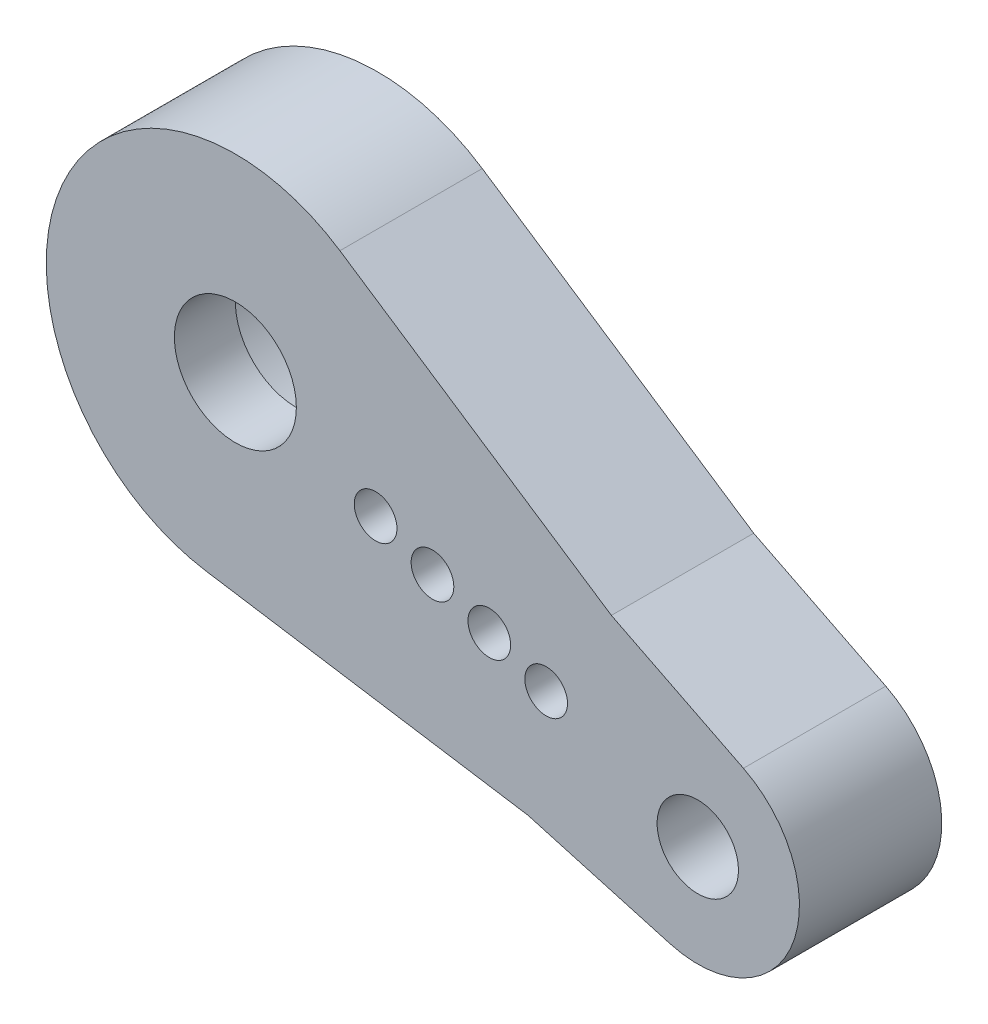
ISO-10303-21;
HEADER;
FILE_DESCRIPTION(('STEP AP214'),'2;1');
FILE_NAME('part.step','',(''),(''),'','','');
FILE_SCHEMA(('AUTOMOTIVE_DESIGN { 1 0 10303 214 1 1 1 1 }'));
ENDSEC;
DATA;
#1=APPLICATION_CONTEXT('core data for automotive mechanical design processes');
#2=APPLICATION_PROTOCOL_DEFINITION('international standard','automotive_design',2000,#1);
#3=PRODUCT_CONTEXT('',#1,'mechanical');
#4=PRODUCT('Part','Part','',(#3));
#5=PRODUCT_RELATED_PRODUCT_CATEGORY('part','',(#4));
#6=PRODUCT_DEFINITION_FORMATION('','',#4);
#7=PRODUCT_DEFINITION_CONTEXT('part definition',#1,'design');
#8=PRODUCT_DEFINITION('design','',#6,#7);
#9=PRODUCT_DEFINITION_SHAPE('','',#8);
#10=(LENGTH_UNIT() NAMED_UNIT(*) SI_UNIT(.MILLI.,.METRE.));
#11=(NAMED_UNIT(*) PLANE_ANGLE_UNIT() SI_UNIT($,.RADIAN.));
#12=(NAMED_UNIT(*) SI_UNIT($,.STERADIAN.) SOLID_ANGLE_UNIT());
#13=UNCERTAINTY_MEASURE_WITH_UNIT(LENGTH_MEASURE(1.E-05),#10,'distance_accuracy_value','');
#14=(GEOMETRIC_REPRESENTATION_CONTEXT(3) GLOBAL_UNCERTAINTY_ASSIGNED_CONTEXT((#13)) GLOBAL_UNIT_ASSIGNED_CONTEXT((#10,
#11,#12)) REPRESENTATION_CONTEXT('',''));
#15=CARTESIAN_POINT('',(0.,0.,0.));
#16=DIRECTION('',(0.,0.,1.));
#17=DIRECTION('',(1.,0.,0.));
#18=AXIS2_PLACEMENT_3D('',#15,#16,#17);
#19=CARTESIAN_POINT('',(0.,0.,0.));
#20=DIRECTION('',(0.,0.,1.));
#21=DIRECTION('',(1.,0.,0.));
#22=AXIS2_PLACEMENT_3D('',#19,#20,#21);
#23=PLANE('',#22);
#24=CARTESIAN_POINT('',(0.,0.,0.));
#25=DIRECTION('',(0.,0.,1.));
#26=DIRECTION('',(1.,0.,0.));
#27=AXIS2_PLACEMENT_3D('',#24,#25,#26);
#28=CIRCLE('',#27,9.29999999999741);
#29=CARTESIAN_POINT('',(5.14147990563152,7.74952801013966,0.));
#30=VERTEX_POINT('',#29);
#31=CARTESIAN_POINT('',(-1.44161315957256,-9.18758681581291,0.));
#32=VERTEX_POINT('',#31);
#33=EDGE_CURVE('E135',#30,#32,#28,.T.);
#34=ORIENTED_EDGE('',*,*,#33,.F.);
#35=DIRECTION('',(-0.833282581735452,0.552847301681304,0.));
#36=VECTOR('',#35,1.);
#37=CARTESIAN_POINT('',(5.14147990563152,7.74952801013966,0.));
#38=LINE('',#37,#36);
#39=CARTESIAN_POINT('',(18.4924768692821,-1.1082866230874,0.));
#40=VERTEX_POINT('',#39);
#41=EDGE_CURVE('E134',#40,#30,#38,.T.);
#42=ORIENTED_EDGE('',*,*,#41,.F.);
#43=DIRECTION('',(-0.893541598745588,0.448980413059609,0.));
#44=VECTOR('',#43,1.);
#45=CARTESIAN_POINT('',(18.4924768692821,-1.1082866230874,0.));
#46=LINE('',#45,#44);
#47=CARTESIAN_POINT('',(24.9874316675281,-4.37182521179307,0.));
#48=VERTEX_POINT('',#47);
#49=EDGE_CURVE('E155',#48,#40,#46,.T.);
#50=ORIENTED_EDGE('',*,*,#49,.F.);
#51=CARTESIAN_POINT('',(22.7425296022301,-8.83953320552101,0.));
#52=DIRECTION('',(0.,0.,1.));
#53=DIRECTION('',(1.,0.,0.));
#54=AXIS2_PLACEMENT_3D('',#51,#52,#53);
#55=CIRCLE('',#54,5.);
#56=CARTESIAN_POINT('',(21.3809785049404,-13.6505807639504,0.));
#57=VERTEX_POINT('',#56);
#58=EDGE_CURVE('E129',#57,#48,#55,.T.);
#59=ORIENTED_EDGE('',*,*,#58,.F.);
#60=DIRECTION('',(0.962209511685877,-0.272310219457931,0.));
#61=VECTOR('',#60,1.);
#62=CARTESIAN_POINT('',(14.3868919468937,-11.6712184500272,0.));
#63=LINE('',#62,#61);
#64=CARTESIAN_POINT('',(14.3868919468937,-11.6712184500272,0.));
#65=VERTEX_POINT('',#64);
#66=EDGE_CURVE('E114',#65,#57,#63,.T.);
#67=ORIENTED_EDGE('',*,*,#66,.F.);
#68=DIRECTION('',(0.987912560840372,-0.155012167696016,0.));
#69=VECTOR('',#68,1.);
#70=CARTESIAN_POINT('',(14.3868919468937,-11.6712184500272,0.));
#71=LINE('',#70,#69);
#72=EDGE_CURVE('E126',#32,#65,#71,.T.);
#73=ORIENTED_EDGE('',*,*,#72,.F.);
#74=EDGE_LOOP('',(#34,#42,#50,#59,#67,#73));
#75=FACE_BOUND('',#74,.T.);
#76=CARTESIAN_POINT('',(0.,0.,0.));
#77=DIRECTION('',(0.,0.,1.));
#78=DIRECTION('',(1.,0.,0.));
#79=AXIS2_PLACEMENT_3D('',#76,#77,#78);
#80=CIRCLE('',#79,6.29999999999742);
#81=CARTESIAN_POINT('',(3.48293800058863,5.24968026493262,0.));
#82=VERTEX_POINT('',#81);
#83=CARTESIAN_POINT('',(-0.976576656484502,-6.22384913329179,0.));
#84=VERTEX_POINT('',#83);
#85=EDGE_CURVE('E56',#82,#84,#80,.T.);
#86=ORIENTED_EDGE('',*,*,#85,.T.);
#87=DIRECTION('',(0.987912560840372,-0.155012167696016,0.));
#88=VECTOR('',#87,1.);
#89=CARTESIAN_POINT('',(14.8519284499817,-8.70748076750607,0.));
#90=LINE('',#89,#88);
#91=CARTESIAN_POINT('',(14.8519284499817,-8.70748076750607,0.));
#92=VERTEX_POINT('',#91);
#93=EDGE_CURVE('E166',#84,#92,#90,.T.);
#94=ORIENTED_EDGE('',*,*,#93,.T.);
#95=CARTESIAN_POINT('',(15.2859625195306,-5.94132559715303,0.));
#96=DIRECTION('',(0.,0.,1.));
#97=DIRECTION('',(1.,0.,0.));
#98=AXIS2_PLACEMENT_3D('',#95,#96,#97);
#99=CIRCLE('',#98,2.8);
#100=CARTESIAN_POINT('',(16.8339349642382,-3.60813436829376,0.));
#101=VERTEX_POINT('',#100);
#102=EDGE_CURVE('E185',#92,#101,#99,.T.);
#103=ORIENTED_EDGE('',*,*,#102,.T.);
#104=DIRECTION('',(-0.833282581735453,0.552847301681304,0.));
#105=VECTOR('',#104,1.);
#106=CARTESIAN_POINT('',(3.48293800058863,5.24968026493262,0.));
#107=LINE('',#106,#105);
#108=EDGE_CURVE('E175',#101,#82,#107,.T.);
#109=ORIENTED_EDGE('',*,*,#108,.T.);
#110=EDGE_LOOP('',(#86,#94,#103,#109));
#111=FACE_BOUND('',#110,.T.);
#112=CARTESIAN_POINT('',(22.7425296022301,-8.83953320552101,0.));
#113=DIRECTION('',(0.,0.,1.));
#114=DIRECTION('',(1.,0.,0.));
#115=AXIS2_PLACEMENT_3D('',#112,#113,#114);
#116=CIRCLE('',#115,2.);
#117=CARTESIAN_POINT('',(24.7425296022301,-8.83953320552101,0.));
#118=VERTEX_POINT('',#117);
#119=EDGE_CURVE('E378',#118,#118,#116,.T.);
#120=ORIENTED_EDGE('',*,*,#119,.T.);
#121=EDGE_LOOP('',(#120));
#122=FACE_BOUND('',#121,.T.);
#123=ADVANCED_FACE('F33',(#75,#111,#122),#23,.F.);
#124=CARTESIAN_POINT('',(0.,0.,4.));
#125=DIRECTION('',(0.,0.,-1.));
#126=DIRECTION('',(-1.,0.,0.));
#127=AXIS2_PLACEMENT_3D('',#124,#125,#126);
#128=CYLINDRICAL_SURFACE('',#127,9.29999999999741);
#129=ORIENTED_EDGE('',*,*,#33,.T.);
#130=DIRECTION('',(0.,0.,-1.));
#131=VECTOR('',#130,1.);
#132=CARTESIAN_POINT('',(-1.44161315957256,-9.18758681581291,4.));
#133=LINE('',#132,#131);
#134=CARTESIAN_POINT('',(-1.44161315957256,-9.18758681581291,7.));
#135=VERTEX_POINT('',#134);
#136=EDGE_CURVE('E11',#135,#32,#133,.T.);
#137=ORIENTED_EDGE('',*,*,#136,.F.);
#138=CARTESIAN_POINT('',(0.,0.,7.));
#139=DIRECTION('',(0.,0.,1.));
#140=DIRECTION('',(1.,0.,0.));
#141=AXIS2_PLACEMENT_3D('',#138,#139,#140);
#142=CIRCLE('',#141,9.29999999999741);
#143=CARTESIAN_POINT('',(5.14147990563152,7.74952801013966,7.));
#144=VERTEX_POINT('',#143);
#145=EDGE_CURVE('E159',#144,#135,#142,.T.);
#146=ORIENTED_EDGE('',*,*,#145,.F.);
#147=DIRECTION('',(0.,0.,-1.));
#148=VECTOR('',#147,1.);
#149=CARTESIAN_POINT('',(5.14147990563152,7.74952801013966,4.));
#150=LINE('',#149,#148);
#151=EDGE_CURVE('E137',#144,#30,#150,.T.);
#152=ORIENTED_EDGE('',*,*,#151,.T.);
#153=EDGE_LOOP('',(#129,#137,#146,#152));
#154=FACE_BOUND('',#153,.T.);
#155=ADVANCED_FACE('F35',(#154),#128,.T.);
#156=CARTESIAN_POINT('',(14.3868919468937,-11.6712184500272,4.));
#157=DIRECTION('',(0.155012167696016,0.987912560840372,0.));
#158=DIRECTION('',(-0.987912560840372,0.155012167696016,0.));
#159=AXIS2_PLACEMENT_3D('',#156,#157,#158);
#160=PLANE('',#159);
#161=ORIENTED_EDGE('',*,*,#72,.T.);
#162=DIRECTION('',(0.,0.,-1.));
#163=VECTOR('',#162,1.);
#164=CARTESIAN_POINT('',(14.3868919468937,-11.6712184500272,4.));
#165=LINE('',#164,#163);
#166=CARTESIAN_POINT('',(14.3868919468937,-11.6712184500272,7.));
#167=VERTEX_POINT('',#166);
#168=EDGE_CURVE('E41',#167,#65,#165,.T.);
#169=ORIENTED_EDGE('',*,*,#168,.F.);
#170=DIRECTION('',(0.987912560840372,-0.155012167696016,0.));
#171=VECTOR('',#170,1.);
#172=CARTESIAN_POINT('',(-1.44161315957256,-9.18758681581291,7.));
#173=LINE('',#172,#171);
#174=EDGE_CURVE('E164',#135,#167,#173,.T.);
#175=ORIENTED_EDGE('',*,*,#174,.F.);
#176=ORIENTED_EDGE('',*,*,#136,.T.);
#177=EDGE_LOOP('',(#161,#169,#175,#176));
#178=FACE_BOUND('',#177,.T.);
#179=ADVANCED_FACE('F132',(#178),#160,.F.);
#180=CARTESIAN_POINT('',(5.14147990563152,7.74952801013966,4.));
#181=DIRECTION('',(-0.552847301681304,-0.833282581735452,0.));
#182=DIRECTION('',(0.833282581735453,-0.552847301681304,0.));
#183=AXIS2_PLACEMENT_3D('',#180,#181,#182);
#184=PLANE('',#183);
#185=ORIENTED_EDGE('',*,*,#41,.T.);
#186=ORIENTED_EDGE('',*,*,#151,.F.);
#187=DIRECTION('',(-0.833282581735452,0.552847301681304,0.));
#188=VECTOR('',#187,1.);
#189=CARTESIAN_POINT('',(18.4924768692821,-1.1082866230874,7.));
#190=LINE('',#189,#188);
#191=CARTESIAN_POINT('',(18.4924768692821,-1.1082866230874,7.));
#192=VERTEX_POINT('',#191);
#193=EDGE_CURVE('E152',#192,#144,#190,.T.);
#194=ORIENTED_EDGE('',*,*,#193,.F.);
#195=DIRECTION('',(0.,0.,-1.));
#196=VECTOR('',#195,1.);
#197=CARTESIAN_POINT('',(18.4924768692821,-1.1082866230874,4.));
#198=LINE('',#197,#196);
#199=EDGE_CURVE('E121',#192,#40,#198,.T.);
#200=ORIENTED_EDGE('',*,*,#199,.T.);
#201=EDGE_LOOP('',(#185,#186,#194,#200));
#202=FACE_BOUND('',#201,.T.);
#203=ADVANCED_FACE('F150',(#202),#184,.F.);
#204=CARTESIAN_POINT('',(0.,0.,4.));
#205=DIRECTION('',(0.,0.,-1.));
#206=DIRECTION('',(-1.,0.,0.));
#207=AXIS2_PLACEMENT_3D('',#204,#205,#206);
#208=CYLINDRICAL_SURFACE('',#207,6.29999999999742);
#209=ORIENTED_EDGE('',*,*,#85,.F.);
#210=DIRECTION('',(0.,0.,-1.));
#211=VECTOR('',#210,1.);
#212=CARTESIAN_POINT('',(3.48293800058863,5.24968026493262,4.));
#213=LINE('',#212,#211);
#214=CARTESIAN_POINT('',(3.48293800058863,5.24968026493262,4.));
#215=VERTEX_POINT('',#214);
#216=EDGE_CURVE('E181',#215,#82,#213,.T.);
#217=ORIENTED_EDGE('',*,*,#216,.F.);
#218=CARTESIAN_POINT('',(0.,0.,4.));
#219=DIRECTION('',(0.,0.,1.));
#220=DIRECTION('',(1.,0.,0.));
#221=AXIS2_PLACEMENT_3D('',#218,#219,#220);
#222=CIRCLE('',#221,6.29999999999742);
#223=CARTESIAN_POINT('',(-0.976576656484502,-6.22384913329179,4.));
#224=VERTEX_POINT('',#223);
#225=EDGE_CURVE('E171',#215,#224,#222,.T.);
#226=ORIENTED_EDGE('',*,*,#225,.T.);
#227=DIRECTION('',(0.,0.,-1.));
#228=VECTOR('',#227,1.);
#229=CARTESIAN_POINT('',(-0.976576656484502,-6.22384913329179,4.));
#230=LINE('',#229,#228);
#231=EDGE_CURVE('E139',#224,#84,#230,.T.);
#232=ORIENTED_EDGE('',*,*,#231,.T.);
#233=EDGE_LOOP('',(#209,#217,#226,#232));
#234=FACE_BOUND('',#233,.T.);
#235=ADVANCED_FACE('F195',(#234),#208,.F.);
#236=CARTESIAN_POINT('',(14.8519284499817,-8.70748076750607,4.));
#237=DIRECTION('',(0.155012167696016,0.987912560840372,0.));
#238=DIRECTION('',(-0.987912560840372,0.155012167696016,0.));
#239=AXIS2_PLACEMENT_3D('',#236,#237,#238);
#240=PLANE('',#239);
#241=ORIENTED_EDGE('',*,*,#93,.F.);
#242=ORIENTED_EDGE('',*,*,#231,.F.);
#243=DIRECTION('',(0.987912560840372,-0.155012167696016,0.));
#244=VECTOR('',#243,1.);
#245=CARTESIAN_POINT('',(14.8519284499817,-8.70748076750607,4.));
#246=LINE('',#245,#244);
#247=CARTESIAN_POINT('',(14.8519284499817,-8.70748076750607,4.));
#248=VERTEX_POINT('',#247);
#249=EDGE_CURVE('E174',#224,#248,#246,.T.);
#250=ORIENTED_EDGE('',*,*,#249,.T.);
#251=DIRECTION('',(0.,0.,-1.));
#252=VECTOR('',#251,1.);
#253=CARTESIAN_POINT('',(14.8519284499817,-8.70748076750607,4.));
#254=LINE('',#253,#252);
#255=EDGE_CURVE('E193',#248,#92,#254,.T.);
#256=ORIENTED_EDGE('',*,*,#255,.T.);
#257=EDGE_LOOP('',(#241,#242,#250,#256));
#258=FACE_BOUND('',#257,.T.);
#259=ADVANCED_FACE('F206',(#258),#240,.T.);
#260=CARTESIAN_POINT('',(15.2859625195306,-5.94132559715303,4.));
#261=DIRECTION('',(0.,0.,-1.));
#262=DIRECTION('',(-1.,0.,0.));
#263=AXIS2_PLACEMENT_3D('',#260,#261,#262);
#264=CYLINDRICAL_SURFACE('',#263,2.8);
#265=ORIENTED_EDGE('',*,*,#102,.F.);
#266=ORIENTED_EDGE('',*,*,#255,.F.);
#267=CARTESIAN_POINT('',(15.2859625195306,-5.94132559715303,4.));
#268=DIRECTION('',(0.,0.,1.));
#269=DIRECTION('',(1.,0.,0.));
#270=AXIS2_PLACEMENT_3D('',#267,#268,#269);
#271=CIRCLE('',#270,2.8);
#272=CARTESIAN_POINT('',(16.8339349642382,-3.60813436829376,4.));
#273=VERTEX_POINT('',#272);
#274=EDGE_CURVE('E178',#248,#273,#271,.T.);
#275=ORIENTED_EDGE('',*,*,#274,.T.);
#276=DIRECTION('',(0.,0.,-1.));
#277=VECTOR('',#276,1.);
#278=CARTESIAN_POINT('',(16.8339349642382,-3.60813436829376,4.));
#279=LINE('',#278,#277);
#280=EDGE_CURVE('E191',#273,#101,#279,.T.);
#281=ORIENTED_EDGE('',*,*,#280,.T.);
#282=EDGE_LOOP('',(#265,#266,#275,#281));
#283=FACE_BOUND('',#282,.T.);
#284=ADVANCED_FACE('F204',(#283),#264,.F.);
#285=CARTESIAN_POINT('',(3.48293800058863,5.24968026493262,4.));
#286=DIRECTION('',(-0.552847301681304,-0.833282581735453,0.));
#287=DIRECTION('',(0.833282581735453,-0.552847301681304,0.));
#288=AXIS2_PLACEMENT_3D('',#285,#286,#287);
#289=PLANE('',#288);
#290=ORIENTED_EDGE('',*,*,#108,.F.);
#291=ORIENTED_EDGE('',*,*,#280,.F.);
#292=DIRECTION('',(-0.833282581735453,0.552847301681304,0.));
#293=VECTOR('',#292,1.);
#294=CARTESIAN_POINT('',(3.48293800058863,5.24968026493262,4.));
#295=LINE('',#294,#293);
#296=EDGE_CURVE('E48',#273,#215,#295,.T.);
#297=ORIENTED_EDGE('',*,*,#296,.T.);
#298=ORIENTED_EDGE('',*,*,#216,.T.);
#299=EDGE_LOOP('',(#290,#291,#297,#298));
#300=FACE_BOUND('',#299,.T.);
#301=ADVANCED_FACE('F201',(#300),#289,.T.);
#302=CARTESIAN_POINT('',(0.,0.,4.));
#303=DIRECTION('',(0.,0.,1.));
#304=DIRECTION('',(1.,0.,0.));
#305=AXIS2_PLACEMENT_3D('',#302,#303,#304);
#306=PLANE('',#305);
#307=CARTESIAN_POINT('',(15.2859625195306,-5.94132559715303,4.));
#308=DIRECTION('',(0.,0.,1.));
#309=DIRECTION('',(1.,0.,0.));
#310=AXIS2_PLACEMENT_3D('',#307,#308,#309);
#311=CIRCLE('',#310,1.05);
#312=CARTESIAN_POINT('',(16.3359625195306,-5.94132559715303,4.));
#313=VERTEX_POINT('',#312);
#314=EDGE_CURVE('E395',#313,#313,#311,.T.);
#315=ORIENTED_EDGE('',*,*,#314,.T.);
#316=EDGE_LOOP('',(#315));
#317=FACE_BOUND('',#316,.T.);
#318=CARTESIAN_POINT('',(12.4897498635548,-4.85449774402923,4.));
#319=DIRECTION('',(0.,0.,1.));
#320=DIRECTION('',(1.,0.,0.));
#321=AXIS2_PLACEMENT_3D('',#318,#319,#320);
#322=CIRCLE('',#321,1.05);
#323=CARTESIAN_POINT('',(13.5397498635548,-4.85449774402923,4.));
#324=VERTEX_POINT('',#323);
#325=EDGE_CURVE('E400',#324,#324,#322,.T.);
#326=ORIENTED_EDGE('',*,*,#325,.T.);
#327=EDGE_LOOP('',(#326));
#328=FACE_BOUND('',#327,.T.);
#329=CARTESIAN_POINT('',(9.69353720754245,-3.76766989089123,4.));
#330=DIRECTION('',(0.,0.,1.));
#331=DIRECTION('',(1.,0.,0.));
#332=AXIS2_PLACEMENT_3D('',#329,#330,#331);
#333=CIRCLE('',#332,1.05);
#334=CARTESIAN_POINT('',(10.7435372075424,-3.76766989089123,4.));
#335=VERTEX_POINT('',#334);
#336=EDGE_CURVE('E406',#335,#335,#333,.T.);
#337=ORIENTED_EDGE('',*,*,#336,.T.);
#338=EDGE_LOOP('',(#337));
#339=FACE_BOUND('',#338,.T.);
#340=CARTESIAN_POINT('',(6.89732455153013,-2.68084203775324,4.));
#341=DIRECTION('',(0.,0.,1.));
#342=DIRECTION('',(1.,0.,0.));
#343=AXIS2_PLACEMENT_3D('',#340,#341,#342);
#344=CIRCLE('',#343,1.05);
#345=CARTESIAN_POINT('',(7.94732455153013,-2.68084203775324,4.));
#346=VERTEX_POINT('',#345);
#347=EDGE_CURVE('E412',#346,#346,#344,.T.);
#348=ORIENTED_EDGE('',*,*,#347,.T.);
#349=EDGE_LOOP('',(#348));
#350=FACE_BOUND('',#349,.T.);
#351=CARTESIAN_POINT('',(0.,0.,4.));
#352=DIRECTION('',(0.,0.,1.));
#353=DIRECTION('',(1.,0.,0.));
#354=AXIS2_PLACEMENT_3D('',#351,#352,#353);
#355=CIRCLE('',#354,3.);
#356=CARTESIAN_POINT('',(3.,0.,4.));
#357=VERTEX_POINT('',#356);
#358=EDGE_CURVE('E418',#357,#357,#355,.T.);
#359=ORIENTED_EDGE('',*,*,#358,.T.);
#360=EDGE_LOOP('',(#359));
#361=FACE_BOUND('',#360,.T.);
#362=ORIENTED_EDGE('',*,*,#249,.F.);
#363=ORIENTED_EDGE('',*,*,#225,.F.);
#364=ORIENTED_EDGE('',*,*,#296,.F.);
#365=ORIENTED_EDGE('',*,*,#274,.F.);
#366=EDGE_LOOP('',(#362,#363,#364,#365));
#367=FACE_BOUND('',#366,.T.);
#368=ADVANCED_FACE('F205',(#317,#328,#339,#350,#361,#367),#306,.F.);
#369=CARTESIAN_POINT('',(0.,0.,7.));
#370=DIRECTION('',(0.,0.,1.));
#371=DIRECTION('',(1.,0.,0.));
#372=AXIS2_PLACEMENT_3D('',#369,#370,#371);
#373=PLANE('',#372);
#374=CARTESIAN_POINT('',(12.4897498635548,-4.85449774402923,7.));
#375=DIRECTION('',(0.,0.,1.));
#376=DIRECTION('',(1.,0.,0.));
#377=AXIS2_PLACEMENT_3D('',#374,#375,#376);
#378=CIRCLE('',#377,1.05);
#379=CARTESIAN_POINT('',(13.5397498635548,-4.85449774402923,7.));
#380=VERTEX_POINT('',#379);
#381=EDGE_CURVE('E403',#380,#380,#378,.T.);
#382=ORIENTED_EDGE('',*,*,#381,.F.);
#383=EDGE_LOOP('',(#382));
#384=FACE_BOUND('',#383,.T.);
#385=CARTESIAN_POINT('',(6.89732455153013,-2.68084203775324,7.));
#386=DIRECTION('',(0.,0.,1.));
#387=DIRECTION('',(1.,0.,0.));
#388=AXIS2_PLACEMENT_3D('',#385,#386,#387);
#389=CIRCLE('',#388,1.05);
#390=CARTESIAN_POINT('',(7.94732455153013,-2.68084203775324,7.));
#391=VERTEX_POINT('',#390);
#392=EDGE_CURVE('E415',#391,#391,#389,.T.);
#393=ORIENTED_EDGE('',*,*,#392,.F.);
#394=EDGE_LOOP('',(#393));
#395=FACE_BOUND('',#394,.T.);
#396=ORIENTED_EDGE('',*,*,#145,.T.);
#397=ORIENTED_EDGE('',*,*,#174,.T.);
#398=DIRECTION('',(0.962209511685877,-0.272310219457931,0.));
#399=VECTOR('',#398,1.);
#400=CARTESIAN_POINT('',(14.3868919468937,-11.6712184500272,7.));
#401=LINE('',#400,#399);
#402=CARTESIAN_POINT('',(21.3809785049404,-13.6505807639504,7.));
#403=VERTEX_POINT('',#402);
#404=EDGE_CURVE('E116',#167,#403,#401,.T.);
#405=ORIENTED_EDGE('',*,*,#404,.T.);
#406=CARTESIAN_POINT('',(22.7425296022301,-8.83953320552101,7.));
#407=DIRECTION('',(0.,0.,1.));
#408=DIRECTION('',(1.,0.,0.));
#409=AXIS2_PLACEMENT_3D('',#406,#407,#408);
#410=CIRCLE('',#409,5.);
#411=CARTESIAN_POINT('',(24.9874316675281,-4.37182521179307,7.));
#412=VERTEX_POINT('',#411);
#413=EDGE_CURVE('E390',#403,#412,#410,.T.);
#414=ORIENTED_EDGE('',*,*,#413,.T.);
#415=DIRECTION('',(-0.893541598745588,0.448980413059609,0.));
#416=VECTOR('',#415,1.);
#417=CARTESIAN_POINT('',(18.4924768692821,-1.1082866230874,7.));
#418=LINE('',#417,#416);
#419=EDGE_CURVE('E130',#412,#192,#418,.T.);
#420=ORIENTED_EDGE('',*,*,#419,.T.);
#421=ORIENTED_EDGE('',*,*,#193,.T.);
#422=EDGE_LOOP('',(#396,#397,#405,#414,#420,#421));
#423=FACE_BOUND('',#422,.T.);
#424=CARTESIAN_POINT('',(0.,0.,7.));
#425=DIRECTION('',(0.,0.,1.));
#426=DIRECTION('',(1.,0.,0.));
#427=AXIS2_PLACEMENT_3D('',#424,#425,#426);
#428=CIRCLE('',#427,3.);
#429=CARTESIAN_POINT('',(3.,0.,7.));
#430=VERTEX_POINT('',#429);
#431=EDGE_CURVE('E421',#430,#430,#428,.T.);
#432=ORIENTED_EDGE('',*,*,#431,.F.);
#433=EDGE_LOOP('',(#432));
#434=FACE_BOUND('',#433,.T.);
#435=CARTESIAN_POINT('',(9.69353720754245,-3.76766989089123,7.));
#436=DIRECTION('',(0.,0.,1.));
#437=DIRECTION('',(1.,0.,0.));
#438=AXIS2_PLACEMENT_3D('',#435,#436,#437);
#439=CIRCLE('',#438,1.05);
#440=CARTESIAN_POINT('',(10.7435372075424,-3.76766989089123,7.));
#441=VERTEX_POINT('',#440);
#442=EDGE_CURVE('E409',#441,#441,#439,.T.);
#443=ORIENTED_EDGE('',*,*,#442,.F.);
#444=EDGE_LOOP('',(#443));
#445=FACE_BOUND('',#444,.T.);
#446=CARTESIAN_POINT('',(15.2859625195306,-5.94132559715303,7.));
#447=DIRECTION('',(0.,0.,1.));
#448=DIRECTION('',(1.,0.,0.));
#449=AXIS2_PLACEMENT_3D('',#446,#447,#448);
#450=CIRCLE('',#449,1.05);
#451=CARTESIAN_POINT('',(16.3359625195306,-5.94132559715303,7.));
#452=VERTEX_POINT('',#451);
#453=EDGE_CURVE('E397',#452,#452,#450,.T.);
#454=ORIENTED_EDGE('',*,*,#453,.F.);
#455=EDGE_LOOP('',(#454));
#456=FACE_BOUND('',#455,.T.);
#457=CARTESIAN_POINT('',(22.7425296022301,-8.83953320552101,7.));
#458=DIRECTION('',(0.,0.,1.));
#459=DIRECTION('',(1.,0.,0.));
#460=AXIS2_PLACEMENT_3D('',#457,#458,#459);
#461=CIRCLE('',#460,2.);
#462=CARTESIAN_POINT('',(24.7425296022301,-8.83953320552101,7.));
#463=VERTEX_POINT('',#462);
#464=EDGE_CURVE('E381',#463,#463,#461,.T.);
#465=ORIENTED_EDGE('',*,*,#464,.F.);
#466=EDGE_LOOP('',(#465));
#467=FACE_BOUND('',#466,.T.);
#468=ADVANCED_FACE('F161',(#384,#395,#423,#434,#445,#456,#467),#373,.T.);
#469=CARTESIAN_POINT('',(0.,0.,7.));
#470=DIRECTION('',(0.,0.,-1.));
#471=DIRECTION('',(-1.,0.,0.));
#472=AXIS2_PLACEMENT_3D('',#469,#470,#471);
#473=CYLINDRICAL_SURFACE('',#472,3.);
#474=ORIENTED_EDGE('',*,*,#431,.T.);
#475=EDGE_LOOP('',(#474));
#476=FACE_BOUND('',#475,.T.);
#477=ORIENTED_EDGE('',*,*,#358,.F.);
#478=EDGE_LOOP('',(#477));
#479=FACE_BOUND('',#478,.T.);
#480=ADVANCED_FACE('F273',(#476,#479),#473,.F.);
#481=CARTESIAN_POINT('',(6.89732455153013,-2.68084203775324,7.));
#482=DIRECTION('',(0.,0.,-1.));
#483=DIRECTION('',(-1.,0.,0.));
#484=AXIS2_PLACEMENT_3D('',#481,#482,#483);
#485=CYLINDRICAL_SURFACE('',#484,1.05);
#486=ORIENTED_EDGE('',*,*,#392,.T.);
#487=EDGE_LOOP('',(#486));
#488=FACE_BOUND('',#487,.T.);
#489=ORIENTED_EDGE('',*,*,#347,.F.);
#490=EDGE_LOOP('',(#489));
#491=FACE_BOUND('',#490,.T.);
#492=ADVANCED_FACE('F278',(#488,#491),#485,.F.);
#493=CARTESIAN_POINT('',(9.69353720754245,-3.76766989089123,7.));
#494=DIRECTION('',(0.,0.,-1.));
#495=DIRECTION('',(-1.,0.,0.));
#496=AXIS2_PLACEMENT_3D('',#493,#494,#495);
#497=CYLINDRICAL_SURFACE('',#496,1.05);
#498=ORIENTED_EDGE('',*,*,#442,.T.);
#499=EDGE_LOOP('',(#498));
#500=FACE_BOUND('',#499,.T.);
#501=ORIENTED_EDGE('',*,*,#336,.F.);
#502=EDGE_LOOP('',(#501));
#503=FACE_BOUND('',#502,.T.);
#504=ADVANCED_FACE('F288',(#500,#503),#497,.F.);
#505=CARTESIAN_POINT('',(12.4897498635548,-4.85449774402923,7.));
#506=DIRECTION('',(0.,0.,-1.));
#507=DIRECTION('',(-1.,0.,0.));
#508=AXIS2_PLACEMENT_3D('',#505,#506,#507);
#509=CYLINDRICAL_SURFACE('',#508,1.05);
#510=ORIENTED_EDGE('',*,*,#381,.T.);
#511=EDGE_LOOP('',(#510));
#512=FACE_BOUND('',#511,.T.);
#513=ORIENTED_EDGE('',*,*,#325,.F.);
#514=EDGE_LOOP('',(#513));
#515=FACE_BOUND('',#514,.T.);
#516=ADVANCED_FACE('F298',(#512,#515),#509,.F.);
#517=CARTESIAN_POINT('',(15.2859625195306,-5.94132559715303,7.));
#518=DIRECTION('',(0.,0.,-1.));
#519=DIRECTION('',(-1.,0.,0.));
#520=AXIS2_PLACEMENT_3D('',#517,#518,#519);
#521=CYLINDRICAL_SURFACE('',#520,1.05);
#522=ORIENTED_EDGE('',*,*,#453,.T.);
#523=EDGE_LOOP('',(#522));
#524=FACE_BOUND('',#523,.T.);
#525=ORIENTED_EDGE('',*,*,#314,.F.);
#526=EDGE_LOOP('',(#525));
#527=FACE_BOUND('',#526,.T.);
#528=ADVANCED_FACE('F308',(#524,#527),#521,.F.);
#529=CARTESIAN_POINT('',(18.4924768692821,-1.1082866230874,0.));
#530=DIRECTION('',(0.448980413059609,0.893541598745589,0.));
#531=DIRECTION('',(-0.893541598745589,0.448980413059609,0.));
#532=AXIS2_PLACEMENT_3D('',#529,#530,#531);
#533=PLANE('',#532);
#534=ORIENTED_EDGE('',*,*,#419,.F.);
#535=DIRECTION('',(0.,0.,1.));
#536=VECTOR('',#535,1.);
#537=CARTESIAN_POINT('',(24.9874316675281,-4.37182521179307,0.));
#538=LINE('',#537,#536);
#539=EDGE_CURVE('E393',#48,#412,#538,.T.);
#540=ORIENTED_EDGE('',*,*,#539,.F.);
#541=ORIENTED_EDGE('',*,*,#49,.T.);
#542=ORIENTED_EDGE('',*,*,#199,.F.);
#543=EDGE_LOOP('',(#534,#540,#541,#542));
#544=FACE_BOUND('',#543,.T.);
#545=ADVANCED_FACE('F317',(#544),#533,.T.);
#546=CARTESIAN_POINT('',(22.7425296022301,-8.83953320552101,0.));
#547=DIRECTION('',(0.,0.,1.));
#548=DIRECTION('',(1.,0.,0.));
#549=AXIS2_PLACEMENT_3D('',#546,#547,#548);
#550=CYLINDRICAL_SURFACE('',#549,5.);
#551=ORIENTED_EDGE('',*,*,#413,.F.);
#552=DIRECTION('',(0.,0.,1.));
#553=VECTOR('',#552,1.);
#554=CARTESIAN_POINT('',(21.3809785049404,-13.6505807639504,0.));
#555=LINE('',#554,#553);
#556=EDGE_CURVE('E388',#57,#403,#555,.T.);
#557=ORIENTED_EDGE('',*,*,#556,.F.);
#558=ORIENTED_EDGE('',*,*,#58,.T.);
#559=ORIENTED_EDGE('',*,*,#539,.T.);
#560=EDGE_LOOP('',(#551,#557,#558,#559));
#561=FACE_BOUND('',#560,.T.);
#562=ADVANCED_FACE('F345',(#561),#550,.T.);
#563=CARTESIAN_POINT('',(14.3868919468937,-11.6712184500272,0.));
#564=DIRECTION('',(-0.272310219457931,-0.962209511685877,0.));
#565=DIRECTION('',(0.962209511685877,-0.272310219457931,0.));
#566=AXIS2_PLACEMENT_3D('',#563,#564,#565);
#567=PLANE('',#566);
#568=ORIENTED_EDGE('',*,*,#404,.F.);
#569=ORIENTED_EDGE('',*,*,#168,.T.);
#570=ORIENTED_EDGE('',*,*,#66,.T.);
#571=ORIENTED_EDGE('',*,*,#556,.T.);
#572=EDGE_LOOP('',(#568,#569,#570,#571));
#573=FACE_BOUND('',#572,.T.);
#574=ADVANCED_FACE('F113',(#573),#567,.T.);
#575=CARTESIAN_POINT('',(22.7425296022301,-8.83953320552101,0.));
#576=DIRECTION('',(0.,0.,1.));
#577=DIRECTION('',(1.,0.,0.));
#578=AXIS2_PLACEMENT_3D('',#575,#576,#577);
#579=CYLINDRICAL_SURFACE('',#578,2.);
#580=ORIENTED_EDGE('',*,*,#119,.F.);
#581=EDGE_LOOP('',(#580));
#582=FACE_BOUND('',#581,.T.);
#583=ORIENTED_EDGE('',*,*,#464,.T.);
#584=EDGE_LOOP('',(#583));
#585=FACE_BOUND('',#584,.T.);
#586=ADVANCED_FACE('F361',(#582,#585),#579,.F.);
#587=CLOSED_SHELL('',(#123,#155,#179,#203,#235,#259,#284,#301,#368,#468,#480,#492,#504,#516,
#528,#545,#562,#574,#586));
#588=MANIFOLD_SOLID_BREP('B2',#587);
#589=ADVANCED_BREP_SHAPE_REPRESENTATION('',(#18,#588),#14);
#590=SHAPE_DEFINITION_REPRESENTATION(#9,#589);
ENDSEC;
END-ISO-10303-21;
